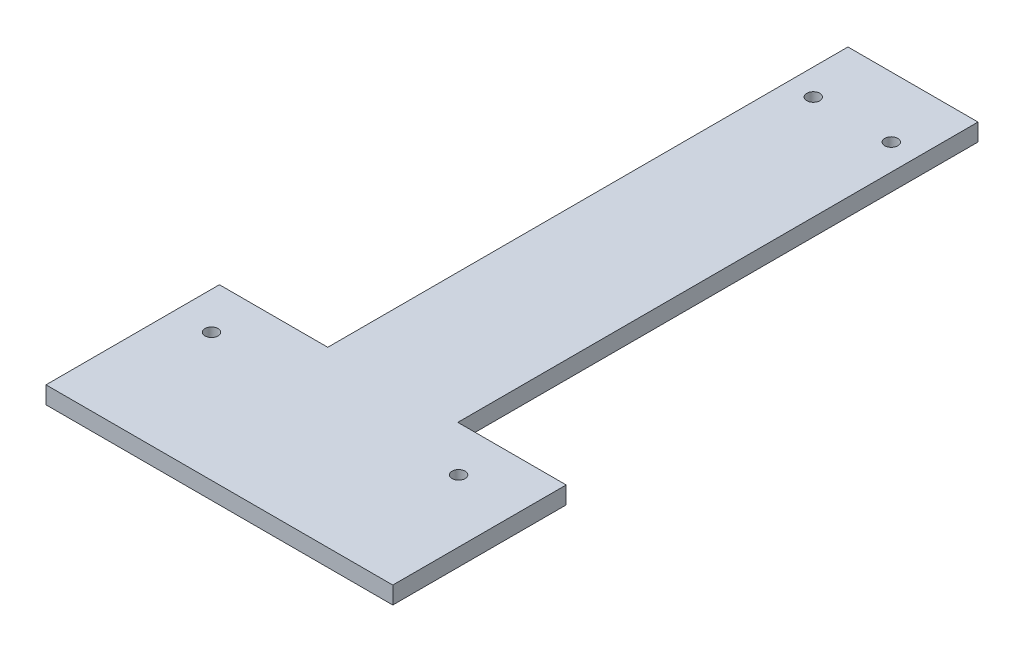
ISO-10303-21;
HEADER;
FILE_DESCRIPTION(('STEP AP214'),'2;1');
FILE_NAME('part.step','',(''),(''),'','','');
FILE_SCHEMA(('AUTOMOTIVE_DESIGN { 1 0 10303 214 1 1 1 1 }'));
ENDSEC;
DATA;
#1=APPLICATION_CONTEXT('core data for automotive mechanical design processes');
#2=APPLICATION_PROTOCOL_DEFINITION('international standard','automotive_design',2000,#1);
#3=PRODUCT_CONTEXT('',#1,'mechanical');
#4=PRODUCT('Part','Part','',(#3));
#5=PRODUCT_RELATED_PRODUCT_CATEGORY('part','',(#4));
#6=PRODUCT_DEFINITION_FORMATION('','',#4);
#7=PRODUCT_DEFINITION_CONTEXT('part definition',#1,'design');
#8=PRODUCT_DEFINITION('design','',#6,#7);
#9=PRODUCT_DEFINITION_SHAPE('','',#8);
#10=(LENGTH_UNIT() NAMED_UNIT(*) SI_UNIT(.MILLI.,.METRE.));
#11=(NAMED_UNIT(*) PLANE_ANGLE_UNIT() SI_UNIT($,.RADIAN.));
#12=(NAMED_UNIT(*) SI_UNIT($,.STERADIAN.) SOLID_ANGLE_UNIT());
#13=UNCERTAINTY_MEASURE_WITH_UNIT(LENGTH_MEASURE(1.E-05),#10,'distance_accuracy_value','');
#14=(GEOMETRIC_REPRESENTATION_CONTEXT(3) GLOBAL_UNCERTAINTY_ASSIGNED_CONTEXT((#13)) GLOBAL_UNIT_ASSIGNED_CONTEXT((#10,
#11,#12)) REPRESENTATION_CONTEXT('',''));
#15=CARTESIAN_POINT('',(0.,0.,0.));
#16=DIRECTION('',(0.,0.,1.));
#17=DIRECTION('',(1.,0.,0.));
#18=AXIS2_PLACEMENT_3D('',#15,#16,#17);
#19=CARTESIAN_POINT('',(15.,0.,80.));
#20=DIRECTION('',(-1.,0.,0.));
#21=DIRECTION('',(0.,0.,1.));
#22=AXIS2_PLACEMENT_3D('',#19,#20,#21);
#23=PLANE('',#22);
#24=DIRECTION('',(0.,0.,-1.));
#25=VECTOR('',#24,1.);
#26=CARTESIAN_POINT('',(15.,2.,80.));
#27=LINE('',#26,#25);
#28=CARTESIAN_POINT('',(15.,2.,60.));
#29=VERTEX_POINT('',#28);
#30=CARTESIAN_POINT('',(15.,2.,0.));
#31=VERTEX_POINT('',#30);
#32=EDGE_CURVE('E46',#29,#31,#27,.T.);
#33=ORIENTED_EDGE('',*,*,#32,.F.);
#34=DIRECTION('',(0.,-1.,0.));
#35=VECTOR('',#34,1.);
#36=CARTESIAN_POINT('',(15.,0.,60.));
#37=LINE('',#36,#35);
#38=CARTESIAN_POINT('',(15.,0.,60.));
#39=VERTEX_POINT('',#38);
#40=EDGE_CURVE('E137',#29,#39,#37,.T.);
#41=ORIENTED_EDGE('',*,*,#40,.T.);
#42=DIRECTION('',(0.,0.,-1.));
#43=VECTOR('',#42,1.);
#44=CARTESIAN_POINT('',(15.,0.,80.));
#45=LINE('',#44,#43);
#46=CARTESIAN_POINT('',(15.,0.,0.));
#47=VERTEX_POINT('',#46);
#48=EDGE_CURVE('E120',#39,#47,#45,.T.);
#49=ORIENTED_EDGE('',*,*,#48,.T.);
#50=DIRECTION('',(0.,1.,0.));
#51=VECTOR('',#50,1.);
#52=CARTESIAN_POINT('',(15.,0.,0.));
#53=LINE('',#52,#51);
#54=EDGE_CURVE('E144',#47,#31,#53,.T.);
#55=ORIENTED_EDGE('',*,*,#54,.T.);
#56=EDGE_LOOP('',(#33,#41,#49,#55));
#57=FACE_BOUND('',#56,.T.);
#58=ADVANCED_FACE('F39',(#57),#23,.F.);
#59=CARTESIAN_POINT('',(15.,2.,80.));
#60=DIRECTION('',(0.,-1.,0.));
#61=DIRECTION('',(1.,0.,0.));
#62=AXIS2_PLACEMENT_3D('',#59,#60,#61);
#63=PLANE('',#62);
#64=CARTESIAN_POINT('',(20.2914325819151,2.,65.2000000000012));
#65=DIRECTION('',(0.,1.,0.));
#66=DIRECTION('',(-1.,0.,0.));
#67=AXIS2_PLACEMENT_3D('',#64,#65,#66);
#68=CIRCLE('',#67,0.750000000000002);
#69=CARTESIAN_POINT('',(19.5414325819151,2.,65.2000000000012));
#70=VERTEX_POINT('',#69);
#71=EDGE_CURVE('E215',#70,#70,#68,.T.);
#72=ORIENTED_EDGE('',*,*,#71,.F.);
#73=EDGE_LOOP('',(#72));
#74=FACE_BOUND('',#73,.T.);
#75=CARTESIAN_POINT('',(3.00000000000052,2.,6.99999999999987));
#76=DIRECTION('',(0.,1.,0.));
#77=DIRECTION('',(-1.,0.,0.));
#78=AXIS2_PLACEMENT_3D('',#75,#76,#77);
#79=CIRCLE('',#78,0.750000000000001);
#80=CARTESIAN_POINT('',(2.25000000000052,2.,6.99999999999987));
#81=VERTEX_POINT('',#80);
#82=EDGE_CURVE('E216',#81,#81,#79,.T.);
#83=ORIENTED_EDGE('',*,*,#82,.F.);
#84=EDGE_LOOP('',(#83));
#85=FACE_BOUND('',#84,.T.);
#86=CARTESIAN_POINT('',(12.0000000000005,2.,7.));
#87=DIRECTION('',(0.,1.,0.));
#88=DIRECTION('',(-1.,0.,0.));
#89=AXIS2_PLACEMENT_3D('',#86,#87,#88);
#90=CIRCLE('',#89,0.75);
#91=CARTESIAN_POINT('',(11.2500000000005,2.,7.));
#92=VERTEX_POINT('',#91);
#93=EDGE_CURVE('E219',#92,#92,#90,.T.);
#94=ORIENTED_EDGE('',*,*,#93,.F.);
#95=EDGE_LOOP('',(#94));
#96=FACE_BOUND('',#95,.T.);
#97=CARTESIAN_POINT('',(-8.2085674180849,2.,65.2000000000012));
#98=DIRECTION('',(0.,1.,0.));
#99=DIRECTION('',(-1.,0.,0.));
#100=AXIS2_PLACEMENT_3D('',#97,#98,#99);
#101=CIRCLE('',#100,0.75);
#102=CARTESIAN_POINT('',(-8.9585674180849,2.,65.2000000000012));
#103=VERTEX_POINT('',#102);
#104=EDGE_CURVE('E224',#103,#103,#101,.T.);
#105=ORIENTED_EDGE('',*,*,#104,.F.);
#106=EDGE_LOOP('',(#105));
#107=FACE_BOUND('',#106,.T.);
#108=DIRECTION('',(-1.,0.,0.));
#109=VECTOR('',#108,1.);
#110=CARTESIAN_POINT('',(15.,2.,80.));
#111=LINE('',#110,#109);
#112=CARTESIAN_POINT('',(27.5,2.,80.));
#113=VERTEX_POINT('',#112);
#114=CARTESIAN_POINT('',(-12.5,2.,80.));
#115=VERTEX_POINT('',#114);
#116=EDGE_CURVE('E148',#113,#115,#111,.T.);
#117=ORIENTED_EDGE('',*,*,#116,.F.);
#118=DIRECTION('',(0.,0.,-1.));
#119=VECTOR('',#118,1.);
#120=CARTESIAN_POINT('',(27.5,2.,80.));
#121=LINE('',#120,#119);
#122=CARTESIAN_POINT('',(27.5,2.,60.));
#123=VERTEX_POINT('',#122);
#124=EDGE_CURVE('E133',#113,#123,#121,.T.);
#125=ORIENTED_EDGE('',*,*,#124,.T.);
#126=DIRECTION('',(-1.,0.,0.));
#127=VECTOR('',#126,1.);
#128=CARTESIAN_POINT('',(27.5,2.,60.));
#129=LINE('',#128,#127);
#130=EDGE_CURVE('E103',#123,#29,#129,.T.);
#131=ORIENTED_EDGE('',*,*,#130,.T.);
#132=ORIENTED_EDGE('',*,*,#32,.T.);
#133=DIRECTION('',(-1.,0.,0.));
#134=VECTOR('',#133,1.);
#135=CARTESIAN_POINT('',(15.,2.,0.));
#136=LINE('',#135,#134);
#137=CARTESIAN_POINT('',(0.,2.,0.));
#138=VERTEX_POINT('',#137);
#139=EDGE_CURVE('E153',#31,#138,#136,.T.);
#140=ORIENTED_EDGE('',*,*,#139,.T.);
#141=DIRECTION('',(0.,0.,-1.));
#142=VECTOR('',#141,1.);
#143=CARTESIAN_POINT('',(0.,2.,80.));
#144=LINE('',#143,#142);
#145=CARTESIAN_POINT('',(0.,2.,60.));
#146=VERTEX_POINT('',#145);
#147=EDGE_CURVE('E162',#146,#138,#144,.T.);
#148=ORIENTED_EDGE('',*,*,#147,.F.);
#149=CARTESIAN_POINT('',(-12.5,2.,60.));
#150=VERTEX_POINT('',#149);
#151=EDGE_CURVE('E61',#146,#150,#129,.T.);
#152=ORIENTED_EDGE('',*,*,#151,.T.);
#153=DIRECTION('',(0.,0.,1.));
#154=VECTOR('',#153,1.);
#155=CARTESIAN_POINT('',(-12.5,2.,80.));
#156=LINE('',#155,#154);
#157=EDGE_CURVE('E122',#150,#115,#156,.T.);
#158=ORIENTED_EDGE('',*,*,#157,.T.);
#159=EDGE_LOOP('',(#117,#125,#131,#132,#140,#148,#152,#158));
#160=FACE_BOUND('',#159,.T.);
#161=ADVANCED_FACE('F170',(#74,#85,#96,#107,#160),#63,.F.);
#162=CARTESIAN_POINT('',(0.,0.,80.));
#163=DIRECTION('',(1.,0.,0.));
#164=DIRECTION('',(0.,0.,-1.));
#165=AXIS2_PLACEMENT_3D('',#162,#163,#164);
#166=PLANE('',#165);
#167=DIRECTION('',(0.,0.,-1.));
#168=VECTOR('',#167,1.);
#169=CARTESIAN_POINT('',(0.,0.,80.));
#170=LINE('',#169,#168);
#171=CARTESIAN_POINT('',(0.,0.,60.));
#172=VERTEX_POINT('',#171);
#173=CARTESIAN_POINT('',(0.,0.,0.));
#174=VERTEX_POINT('',#173);
#175=EDGE_CURVE('E161',#172,#174,#170,.T.);
#176=ORIENTED_EDGE('',*,*,#175,.F.);
#177=DIRECTION('',(0.,1.,0.));
#178=VECTOR('',#177,1.);
#179=CARTESIAN_POINT('',(0.,0.,60.));
#180=LINE('',#179,#178);
#181=EDGE_CURVE('E11',#172,#146,#180,.T.);
#182=ORIENTED_EDGE('',*,*,#181,.T.);
#183=ORIENTED_EDGE('',*,*,#147,.T.);
#184=DIRECTION('',(0.,-1.,0.));
#185=VECTOR('',#184,1.);
#186=CARTESIAN_POINT('',(0.,0.,0.));
#187=LINE('',#186,#185);
#188=EDGE_CURVE('E156',#138,#174,#187,.T.);
#189=ORIENTED_EDGE('',*,*,#188,.T.);
#190=EDGE_LOOP('',(#176,#182,#183,#189));
#191=FACE_BOUND('',#190,.T.);
#192=ADVANCED_FACE('F177',(#191),#166,.F.);
#193=CARTESIAN_POINT('',(15.,0.,80.));
#194=DIRECTION('',(0.,1.,0.));
#195=DIRECTION('',(-1.,0.,0.));
#196=AXIS2_PLACEMENT_3D('',#193,#194,#195);
#197=PLANE('',#196);
#198=CARTESIAN_POINT('',(20.2914325819151,0.,65.2000000000012));
#199=DIRECTION('',(0.,1.,0.));
#200=DIRECTION('',(-1.,0.,0.));
#201=AXIS2_PLACEMENT_3D('',#198,#199,#200);
#202=CIRCLE('',#201,0.750000000000002);
#203=CARTESIAN_POINT('',(19.5414325819151,0.,65.2000000000012));
#204=VERTEX_POINT('',#203);
#205=EDGE_CURVE('E136',#204,#204,#202,.T.);
#206=ORIENTED_EDGE('',*,*,#205,.T.);
#207=EDGE_LOOP('',(#206));
#208=FACE_BOUND('',#207,.T.);
#209=CARTESIAN_POINT('',(3.00000000000052,0.,6.99999999999987));
#210=DIRECTION('',(0.,1.,0.));
#211=DIRECTION('',(-1.,0.,0.));
#212=AXIS2_PLACEMENT_3D('',#209,#210,#211);
#213=CIRCLE('',#212,0.750000000000001);
#214=CARTESIAN_POINT('',(2.25000000000052,0.,6.99999999999987));
#215=VERTEX_POINT('',#214);
#216=EDGE_CURVE('E231',#215,#215,#213,.T.);
#217=ORIENTED_EDGE('',*,*,#216,.T.);
#218=EDGE_LOOP('',(#217));
#219=FACE_BOUND('',#218,.T.);
#220=CARTESIAN_POINT('',(12.0000000000005,0.,7.));
#221=DIRECTION('',(0.,1.,0.));
#222=DIRECTION('',(-1.,0.,0.));
#223=AXIS2_PLACEMENT_3D('',#220,#221,#222);
#224=CIRCLE('',#223,0.75);
#225=CARTESIAN_POINT('',(11.2500000000005,0.,7.));
#226=VERTEX_POINT('',#225);
#227=EDGE_CURVE('E129',#226,#226,#224,.T.);
#228=ORIENTED_EDGE('',*,*,#227,.T.);
#229=EDGE_LOOP('',(#228));
#230=FACE_BOUND('',#229,.T.);
#231=CARTESIAN_POINT('',(-8.2085674180849,0.,65.2000000000012));
#232=DIRECTION('',(0.,1.,0.));
#233=DIRECTION('',(-1.,0.,0.));
#234=AXIS2_PLACEMENT_3D('',#231,#232,#233);
#235=CIRCLE('',#234,0.75);
#236=CARTESIAN_POINT('',(-8.9585674180849,0.,65.2000000000012));
#237=VERTEX_POINT('',#236);
#238=EDGE_CURVE('E223',#237,#237,#235,.T.);
#239=ORIENTED_EDGE('',*,*,#238,.T.);
#240=EDGE_LOOP('',(#239));
#241=FACE_BOUND('',#240,.T.);
#242=ORIENTED_EDGE('',*,*,#48,.F.);
#243=DIRECTION('',(-1.,0.,0.));
#244=VECTOR('',#243,1.);
#245=CARTESIAN_POINT('',(27.5,0.,60.));
#246=LINE('',#245,#244);
#247=CARTESIAN_POINT('',(27.5,0.,60.));
#248=VERTEX_POINT('',#247);
#249=EDGE_CURVE('E52',#248,#39,#246,.T.);
#250=ORIENTED_EDGE('',*,*,#249,.F.);
#251=DIRECTION('',(0.,0.,-1.));
#252=VECTOR('',#251,1.);
#253=CARTESIAN_POINT('',(27.5,0.,80.));
#254=LINE('',#253,#252);
#255=CARTESIAN_POINT('',(27.5,0.,80.));
#256=VERTEX_POINT('',#255);
#257=EDGE_CURVE('E113',#256,#248,#254,.T.);
#258=ORIENTED_EDGE('',*,*,#257,.F.);
#259=DIRECTION('',(1.,0.,0.));
#260=VECTOR('',#259,1.);
#261=CARTESIAN_POINT('',(15.,0.,80.));
#262=LINE('',#261,#260);
#263=CARTESIAN_POINT('',(-12.5,0.,80.));
#264=VERTEX_POINT('',#263);
#265=EDGE_CURVE('E146',#264,#256,#262,.T.);
#266=ORIENTED_EDGE('',*,*,#265,.F.);
#267=DIRECTION('',(0.,0.,1.));
#268=VECTOR('',#267,1.);
#269=CARTESIAN_POINT('',(-12.5,0.,80.));
#270=LINE('',#269,#268);
#271=CARTESIAN_POINT('',(-12.5,0.,60.));
#272=VERTEX_POINT('',#271);
#273=EDGE_CURVE('E108',#272,#264,#270,.T.);
#274=ORIENTED_EDGE('',*,*,#273,.F.);
#275=EDGE_CURVE('E117',#172,#272,#246,.T.);
#276=ORIENTED_EDGE('',*,*,#275,.F.);
#277=ORIENTED_EDGE('',*,*,#175,.T.);
#278=DIRECTION('',(1.,0.,0.));
#279=VECTOR('',#278,1.);
#280=CARTESIAN_POINT('',(15.,0.,0.));
#281=LINE('',#280,#279);
#282=EDGE_CURVE('E149',#174,#47,#281,.T.);
#283=ORIENTED_EDGE('',*,*,#282,.T.);
#284=EDGE_LOOP('',(#242,#250,#258,#266,#274,#276,#277,#283));
#285=FACE_BOUND('',#284,.T.);
#286=ADVANCED_FACE('F111',(#208,#219,#230,#241,#285),#197,.F.);
#287=CARTESIAN_POINT('',(0.,0.,80.));
#288=DIRECTION('',(0.,0.,1.));
#289=DIRECTION('',(1.,0.,0.));
#290=AXIS2_PLACEMENT_3D('',#287,#288,#289);
#291=PLANE('',#290);
#292=ORIENTED_EDGE('',*,*,#265,.T.);
#293=DIRECTION('',(0.,1.,0.));
#294=VECTOR('',#293,1.);
#295=CARTESIAN_POINT('',(27.5,0.,80.));
#296=LINE('',#295,#294);
#297=EDGE_CURVE('E123',#256,#113,#296,.T.);
#298=ORIENTED_EDGE('',*,*,#297,.T.);
#299=ORIENTED_EDGE('',*,*,#116,.T.);
#300=DIRECTION('',(0.,1.,0.));
#301=VECTOR('',#300,1.);
#302=CARTESIAN_POINT('',(-12.5,0.,80.));
#303=LINE('',#302,#301);
#304=EDGE_CURVE('E139',#264,#115,#303,.T.);
#305=ORIENTED_EDGE('',*,*,#304,.F.);
#306=EDGE_LOOP('',(#292,#298,#299,#305));
#307=FACE_BOUND('',#306,.T.);
#308=ADVANCED_FACE('F190',(#307),#291,.T.);
#309=CARTESIAN_POINT('',(0.,0.,0.));
#310=DIRECTION('',(0.,0.,1.));
#311=DIRECTION('',(1.,0.,0.));
#312=AXIS2_PLACEMENT_3D('',#309,#310,#311);
#313=PLANE('',#312);
#314=ORIENTED_EDGE('',*,*,#54,.F.);
#315=ORIENTED_EDGE('',*,*,#282,.F.);
#316=ORIENTED_EDGE('',*,*,#188,.F.);
#317=ORIENTED_EDGE('',*,*,#139,.F.);
#318=EDGE_LOOP('',(#314,#315,#316,#317));
#319=FACE_BOUND('',#318,.T.);
#320=ADVANCED_FACE('F172',(#319),#313,.F.);
#321=CARTESIAN_POINT('',(-12.5,0.,80.));
#322=DIRECTION('',(-1.,0.,0.));
#323=DIRECTION('',(0.,0.,1.));
#324=AXIS2_PLACEMENT_3D('',#321,#322,#323);
#325=PLANE('',#324);
#326=ORIENTED_EDGE('',*,*,#157,.F.);
#327=DIRECTION('',(0.,1.,0.));
#328=VECTOR('',#327,1.);
#329=CARTESIAN_POINT('',(-12.5,0.,60.));
#330=LINE('',#329,#328);
#331=EDGE_CURVE('E107',#272,#150,#330,.T.);
#332=ORIENTED_EDGE('',*,*,#331,.F.);
#333=ORIENTED_EDGE('',*,*,#273,.T.);
#334=ORIENTED_EDGE('',*,*,#304,.T.);
#335=EDGE_LOOP('',(#326,#332,#333,#334));
#336=FACE_BOUND('',#335,.T.);
#337=ADVANCED_FACE('F184',(#336),#325,.T.);
#338=CARTESIAN_POINT('',(27.5,0.,60.));
#339=DIRECTION('',(0.,0.,-1.));
#340=DIRECTION('',(-1.,0.,0.));
#341=AXIS2_PLACEMENT_3D('',#338,#339,#340);
#342=PLANE('',#341);
#343=ORIENTED_EDGE('',*,*,#181,.F.);
#344=ORIENTED_EDGE('',*,*,#275,.T.);
#345=ORIENTED_EDGE('',*,*,#331,.T.);
#346=ORIENTED_EDGE('',*,*,#151,.F.);
#347=EDGE_LOOP('',(#343,#344,#345,#346));
#348=FACE_BOUND('',#347,.T.);
#349=ADVANCED_FACE('F185',(#348),#342,.T.);
#350=ORIENTED_EDGE('',*,*,#40,.F.);
#351=ORIENTED_EDGE('',*,*,#130,.F.);
#352=DIRECTION('',(0.,1.,0.));
#353=VECTOR('',#352,1.);
#354=CARTESIAN_POINT('',(27.5,0.,60.));
#355=LINE('',#354,#353);
#356=EDGE_CURVE('E99',#248,#123,#355,.T.);
#357=ORIENTED_EDGE('',*,*,#356,.F.);
#358=ORIENTED_EDGE('',*,*,#249,.T.);
#359=EDGE_LOOP('',(#350,#351,#357,#358));
#360=FACE_BOUND('',#359,.T.);
#361=ADVANCED_FACE('F101',(#360),#342,.T.);
#362=CARTESIAN_POINT('',(27.5,0.,80.));
#363=DIRECTION('',(1.,0.,0.));
#364=DIRECTION('',(0.,1.,0.));
#365=AXIS2_PLACEMENT_3D('',#362,#363,#364);
#366=PLANE('',#365);
#367=ORIENTED_EDGE('',*,*,#124,.F.);
#368=ORIENTED_EDGE('',*,*,#297,.F.);
#369=ORIENTED_EDGE('',*,*,#257,.T.);
#370=ORIENTED_EDGE('',*,*,#356,.T.);
#371=EDGE_LOOP('',(#367,#368,#369,#370));
#372=FACE_BOUND('',#371,.T.);
#373=ADVANCED_FACE('F121',(#372),#366,.T.);
#374=CARTESIAN_POINT('',(-8.2085674180849,0.,65.2000000000012));
#375=DIRECTION('',(0.,1.,0.));
#376=DIRECTION('',(-1.,0.,0.));
#377=AXIS2_PLACEMENT_3D('',#374,#375,#376);
#378=CYLINDRICAL_SURFACE('',#377,0.75);
#379=ORIENTED_EDGE('',*,*,#238,.F.);
#380=EDGE_LOOP('',(#379));
#381=FACE_BOUND('',#380,.T.);
#382=ORIENTED_EDGE('',*,*,#104,.T.);
#383=EDGE_LOOP('',(#382));
#384=FACE_BOUND('',#383,.T.);
#385=ADVANCED_FACE('F258',(#381,#384),#378,.F.);
#386=CARTESIAN_POINT('',(12.0000000000005,0.,7.));
#387=DIRECTION('',(0.,1.,0.));
#388=DIRECTION('',(-1.,0.,0.));
#389=AXIS2_PLACEMENT_3D('',#386,#387,#388);
#390=CYLINDRICAL_SURFACE('',#389,0.75);
#391=ORIENTED_EDGE('',*,*,#227,.F.);
#392=EDGE_LOOP('',(#391));
#393=FACE_BOUND('',#392,.T.);
#394=ORIENTED_EDGE('',*,*,#93,.T.);
#395=EDGE_LOOP('',(#394));
#396=FACE_BOUND('',#395,.T.);
#397=ADVANCED_FACE('F252',(#393,#396),#390,.F.);
#398=CARTESIAN_POINT('',(3.00000000000052,0.,6.99999999999987));
#399=DIRECTION('',(0.,1.,0.));
#400=DIRECTION('',(-1.,0.,0.));
#401=AXIS2_PLACEMENT_3D('',#398,#399,#400);
#402=CYLINDRICAL_SURFACE('',#401,0.750000000000001);
#403=ORIENTED_EDGE('',*,*,#216,.F.);
#404=EDGE_LOOP('',(#403));
#405=FACE_BOUND('',#404,.T.);
#406=ORIENTED_EDGE('',*,*,#82,.T.);
#407=EDGE_LOOP('',(#406));
#408=FACE_BOUND('',#407,.T.);
#409=ADVANCED_FACE('F250',(#405,#408),#402,.F.);
#410=CARTESIAN_POINT('',(20.2914325819151,0.,65.2000000000012));
#411=DIRECTION('',(0.,1.,0.));
#412=DIRECTION('',(-1.,0.,0.));
#413=AXIS2_PLACEMENT_3D('',#410,#411,#412);
#414=CYLINDRICAL_SURFACE('',#413,0.750000000000002);
#415=ORIENTED_EDGE('',*,*,#205,.F.);
#416=EDGE_LOOP('',(#415));
#417=FACE_BOUND('',#416,.T.);
#418=ORIENTED_EDGE('',*,*,#71,.T.);
#419=EDGE_LOOP('',(#418));
#420=FACE_BOUND('',#419,.T.);
#421=ADVANCED_FACE('F243',(#417,#420),#414,.F.);
#422=CLOSED_SHELL('',(#58,#161,#192,#286,#308,#320,#337,#349,#361,#373,#385,#397,#409,#421));
#423=MANIFOLD_SOLID_BREP('B2',#422);
#424=ADVANCED_BREP_SHAPE_REPRESENTATION('',(#18,#423),#14);
#425=SHAPE_DEFINITION_REPRESENTATION(#9,#424);
ENDSEC;
END-ISO-10303-21;
